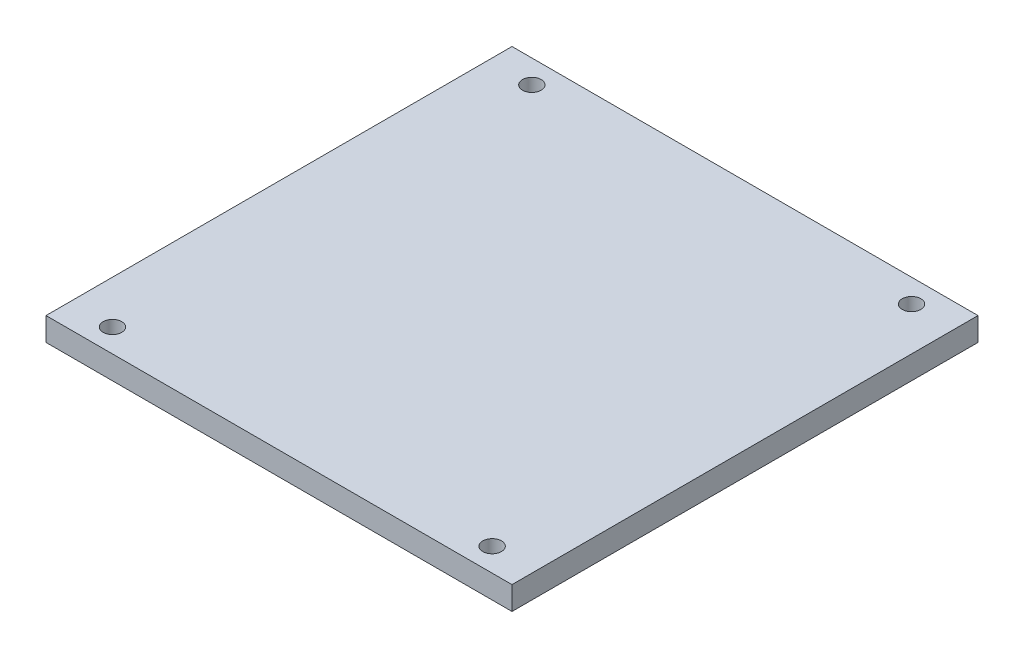
ISO-10303-21;
HEADER;
FILE_DESCRIPTION(('STEP AP214'),'2;1');
FILE_NAME('part.step','',(''),(''),'','','');
FILE_SCHEMA(('AUTOMOTIVE_DESIGN { 1 0 10303 214 1 1 1 1 }'));
ENDSEC;
DATA;
#1=APPLICATION_CONTEXT('core data for automotive mechanical design processes');
#2=APPLICATION_PROTOCOL_DEFINITION('international standard','automotive_design',2000,#1);
#3=PRODUCT_CONTEXT('',#1,'mechanical');
#4=PRODUCT('Part','Part','',(#3));
#5=PRODUCT_RELATED_PRODUCT_CATEGORY('part','',(#4));
#6=PRODUCT_DEFINITION_FORMATION('','',#4);
#7=PRODUCT_DEFINITION_CONTEXT('part definition',#1,'design');
#8=PRODUCT_DEFINITION('design','',#6,#7);
#9=PRODUCT_DEFINITION_SHAPE('','',#8);
#10=(LENGTH_UNIT() NAMED_UNIT(*) SI_UNIT(.MILLI.,.METRE.));
#11=(NAMED_UNIT(*) PLANE_ANGLE_UNIT() SI_UNIT($,.RADIAN.));
#12=(NAMED_UNIT(*) SI_UNIT($,.STERADIAN.) SOLID_ANGLE_UNIT());
#13=UNCERTAINTY_MEASURE_WITH_UNIT(LENGTH_MEASURE(1.E-05),#10,'distance_accuracy_value','');
#14=(GEOMETRIC_REPRESENTATION_CONTEXT(3) GLOBAL_UNCERTAINTY_ASSIGNED_CONTEXT((#13)) GLOBAL_UNIT_ASSIGNED_CONTEXT((#10,
#11,#12)) REPRESENTATION_CONTEXT('',''));
#15=CARTESIAN_POINT('',(0.,0.,0.));
#16=DIRECTION('',(0.,0.,1.));
#17=DIRECTION('',(1.,0.,0.));
#18=AXIS2_PLACEMENT_3D('',#15,#16,#17);
#19=CARTESIAN_POINT('',(63.5,6.35,63.5));
#20=DIRECTION('',(-1.,0.,0.));
#21=DIRECTION('',(0.,0.,1.));
#22=AXIS2_PLACEMENT_3D('',#19,#20,#21);
#23=PLANE('',#22);
#24=DIRECTION('',(0.,0.,-1.));
#25=VECTOR('',#24,1.);
#26=CARTESIAN_POINT('',(63.5,0.,63.5));
#27=LINE('',#26,#25);
#28=CARTESIAN_POINT('',(63.5,0.,63.5));
#29=VERTEX_POINT('',#28);
#30=CARTESIAN_POINT('',(63.5,0.,-63.5));
#31=VERTEX_POINT('',#30);
#32=EDGE_CURVE('E114',#29,#31,#27,.T.);
#33=ORIENTED_EDGE('',*,*,#32,.T.);
#34=DIRECTION('',(0.,-1.,0.));
#35=VECTOR('',#34,1.);
#36=CARTESIAN_POINT('',(63.5,6.35,-63.5));
#37=LINE('',#36,#35);
#38=CARTESIAN_POINT('',(63.5,6.35,-63.5));
#39=VERTEX_POINT('',#38);
#40=EDGE_CURVE('E11',#39,#31,#37,.T.);
#41=ORIENTED_EDGE('',*,*,#40,.F.);
#42=DIRECTION('',(0.,0.,-1.));
#43=VECTOR('',#42,1.);
#44=CARTESIAN_POINT('',(63.5,6.35,63.5));
#45=LINE('',#44,#43);
#46=CARTESIAN_POINT('',(63.5,6.35,63.5));
#47=VERTEX_POINT('',#46);
#48=EDGE_CURVE('E97',#47,#39,#45,.T.);
#49=ORIENTED_EDGE('',*,*,#48,.F.);
#50=DIRECTION('',(0.,-1.,0.));
#51=VECTOR('',#50,1.);
#52=CARTESIAN_POINT('',(63.5,6.35,63.5));
#53=LINE('',#52,#51);
#54=EDGE_CURVE('E110',#47,#29,#53,.T.);
#55=ORIENTED_EDGE('',*,*,#54,.T.);
#56=EDGE_LOOP('',(#33,#41,#49,#55));
#57=FACE_BOUND('',#56,.T.);
#58=ADVANCED_FACE('F43',(#57),#23,.F.);
#59=CARTESIAN_POINT('',(-63.5,6.35,-63.5));
#60=DIRECTION('',(0.,0.,1.));
#61=DIRECTION('',(1.,0.,0.));
#62=AXIS2_PLACEMENT_3D('',#59,#60,#61);
#63=PLANE('',#62);
#64=DIRECTION('',(-1.,0.,0.));
#65=VECTOR('',#64,1.);
#66=CARTESIAN_POINT('',(-63.5,0.,-63.5));
#67=LINE('',#66,#65);
#68=CARTESIAN_POINT('',(-63.5,0.,-63.5));
#69=VERTEX_POINT('',#68);
#70=EDGE_CURVE('E102',#31,#69,#67,.T.);
#71=ORIENTED_EDGE('',*,*,#70,.T.);
#72=DIRECTION('',(0.,-1.,0.));
#73=VECTOR('',#72,1.);
#74=CARTESIAN_POINT('',(-63.5,6.35,-63.5));
#75=LINE('',#74,#73);
#76=CARTESIAN_POINT('',(-63.5,6.35,-63.5));
#77=VERTEX_POINT('',#76);
#78=EDGE_CURVE('E53',#77,#69,#75,.T.);
#79=ORIENTED_EDGE('',*,*,#78,.F.);
#80=DIRECTION('',(-1.,0.,0.));
#81=VECTOR('',#80,1.);
#82=CARTESIAN_POINT('',(-63.5,6.35,-63.5));
#83=LINE('',#82,#81);
#84=EDGE_CURVE('E92',#39,#77,#83,.T.);
#85=ORIENTED_EDGE('',*,*,#84,.F.);
#86=ORIENTED_EDGE('',*,*,#40,.T.);
#87=EDGE_LOOP('',(#71,#79,#85,#86));
#88=FACE_BOUND('',#87,.T.);
#89=ADVANCED_FACE('F101',(#88),#63,.F.);
#90=CARTESIAN_POINT('',(-63.5,6.35,63.5));
#91=DIRECTION('',(1.,0.,0.));
#92=DIRECTION('',(0.,0.,-1.));
#93=AXIS2_PLACEMENT_3D('',#90,#91,#92);
#94=PLANE('',#93);
#95=DIRECTION('',(0.,0.,1.));
#96=VECTOR('',#95,1.);
#97=CARTESIAN_POINT('',(-63.5,0.,63.5));
#98=LINE('',#97,#96);
#99=CARTESIAN_POINT('',(-63.5,0.,63.5));
#100=VERTEX_POINT('',#99);
#101=EDGE_CURVE('E79',#69,#100,#98,.T.);
#102=ORIENTED_EDGE('',*,*,#101,.T.);
#103=DIRECTION('',(0.,-1.,0.));
#104=VECTOR('',#103,1.);
#105=CARTESIAN_POINT('',(-63.5,6.35,63.5));
#106=LINE('',#105,#104);
#107=CARTESIAN_POINT('',(-63.5,6.35,63.5));
#108=VERTEX_POINT('',#107);
#109=EDGE_CURVE('E104',#108,#100,#106,.T.);
#110=ORIENTED_EDGE('',*,*,#109,.F.);
#111=DIRECTION('',(0.,0.,1.));
#112=VECTOR('',#111,1.);
#113=CARTESIAN_POINT('',(-63.5,6.35,63.5));
#114=LINE('',#113,#112);
#115=EDGE_CURVE('E95',#77,#108,#114,.T.);
#116=ORIENTED_EDGE('',*,*,#115,.F.);
#117=ORIENTED_EDGE('',*,*,#78,.T.);
#118=EDGE_LOOP('',(#102,#110,#116,#117));
#119=FACE_BOUND('',#118,.T.);
#120=ADVANCED_FACE('F106',(#119),#94,.F.);
#121=CARTESIAN_POINT('',(-63.5,6.35,63.5));
#122=DIRECTION('',(0.,0.,-1.));
#123=DIRECTION('',(-1.,0.,0.));
#124=AXIS2_PLACEMENT_3D('',#121,#122,#123);
#125=PLANE('',#124);
#126=DIRECTION('',(1.,0.,0.));
#127=VECTOR('',#126,1.);
#128=CARTESIAN_POINT('',(-63.5,0.,63.5));
#129=LINE('',#128,#127);
#130=EDGE_CURVE('E85',#100,#29,#129,.T.);
#131=ORIENTED_EDGE('',*,*,#130,.T.);
#132=ORIENTED_EDGE('',*,*,#54,.F.);
#133=DIRECTION('',(1.,0.,0.));
#134=VECTOR('',#133,1.);
#135=CARTESIAN_POINT('',(-63.5,6.35,63.5));
#136=LINE('',#135,#134);
#137=EDGE_CURVE('E62',#108,#47,#136,.T.);
#138=ORIENTED_EDGE('',*,*,#137,.F.);
#139=ORIENTED_EDGE('',*,*,#109,.T.);
#140=EDGE_LOOP('',(#131,#132,#138,#139));
#141=FACE_BOUND('',#140,.T.);
#142=ADVANCED_FACE('F160',(#141),#125,.F.);
#143=CARTESIAN_POINT('',(0.,6.35,0.));
#144=DIRECTION('',(0.,-1.,0.));
#145=DIRECTION('',(0.,0.,-1.));
#146=AXIS2_PLACEMENT_3D('',#143,#144,#145);
#147=PLANE('',#146);
#148=CARTESIAN_POINT('',(51.7381484466503,6.35,-57.15));
#149=DIRECTION('',(0.,1.,0.));
#150=DIRECTION('',(0.,0.,1.));
#151=AXIS2_PLACEMENT_3D('',#148,#149,#150);
#152=CIRCLE('',#151,2.53999999999999);
#153=CARTESIAN_POINT('',(51.7381484466503,6.35,-54.61));
#154=VERTEX_POINT('',#153);
#155=EDGE_CURVE('E268',#154,#154,#152,.T.);
#156=ORIENTED_EDGE('',*,*,#155,.F.);
#157=EDGE_LOOP('',(#156));
#158=FACE_BOUND('',#157,.T.);
#159=CARTESIAN_POINT('',(-51.7381484466501,6.35,57.15));
#160=DIRECTION('',(0.,1.,0.));
#161=DIRECTION('',(0.,0.,1.));
#162=AXIS2_PLACEMENT_3D('',#159,#160,#161);
#163=CIRCLE('',#162,2.54000000000001);
#164=CARTESIAN_POINT('',(-51.7381484466501,6.35,59.69));
#165=VERTEX_POINT('',#164);
#166=EDGE_CURVE('E265',#165,#165,#163,.T.);
#167=ORIENTED_EDGE('',*,*,#166,.F.);
#168=EDGE_LOOP('',(#167));
#169=FACE_BOUND('',#168,.T.);
#170=CARTESIAN_POINT('',(51.7381484466503,6.35,57.15));
#171=DIRECTION('',(0.,1.,0.));
#172=DIRECTION('',(0.,0.,1.));
#173=AXIS2_PLACEMENT_3D('',#170,#171,#172);
#174=CIRCLE('',#173,2.54000000000001);
#175=CARTESIAN_POINT('',(51.7381484466503,6.35,59.69));
#176=VERTEX_POINT('',#175);
#177=EDGE_CURVE('E269',#176,#176,#174,.T.);
#178=ORIENTED_EDGE('',*,*,#177,.F.);
#179=EDGE_LOOP('',(#178));
#180=FACE_BOUND('',#179,.T.);
#181=CARTESIAN_POINT('',(-51.73814844665,6.35,-57.15));
#182=DIRECTION('',(0.,1.,0.));
#183=DIRECTION('',(0.,0.,1.));
#184=AXIS2_PLACEMENT_3D('',#181,#182,#183);
#185=CIRCLE('',#184,2.53999999999998);
#186=CARTESIAN_POINT('',(-51.73814844665,6.35,-54.61));
#187=VERTEX_POINT('',#186);
#188=EDGE_CURVE('E133',#187,#187,#185,.T.);
#189=ORIENTED_EDGE('',*,*,#188,.F.);
#190=EDGE_LOOP('',(#189));
#191=FACE_BOUND('',#190,.T.);
#192=ORIENTED_EDGE('',*,*,#48,.T.);
#193=ORIENTED_EDGE('',*,*,#84,.T.);
#194=ORIENTED_EDGE('',*,*,#115,.T.);
#195=ORIENTED_EDGE('',*,*,#137,.T.);
#196=EDGE_LOOP('',(#192,#193,#194,#195));
#197=FACE_BOUND('',#196,.T.);
#198=ADVANCED_FACE('F93',(#158,#169,#180,#191,#197),#147,.F.);
#199=CARTESIAN_POINT('',(0.,0.,0.));
#200=DIRECTION('',(0.,-1.,0.));
#201=DIRECTION('',(0.,0.,-1.));
#202=AXIS2_PLACEMENT_3D('',#199,#200,#201);
#203=PLANE('',#202);
#204=CARTESIAN_POINT('',(51.7381484466503,0.,-57.15));
#205=DIRECTION('',(0.,-1.,0.));
#206=DIRECTION('',(0.,0.,-1.));
#207=AXIS2_PLACEMENT_3D('',#204,#205,#206);
#208=CIRCLE('',#207,2.53999999999999);
#209=CARTESIAN_POINT('',(51.7381484466503,0.,-54.61));
#210=VERTEX_POINT('',#209);
#211=EDGE_CURVE('E46',#210,#210,#208,.T.);
#212=ORIENTED_EDGE('',*,*,#211,.F.);
#213=EDGE_LOOP('',(#212));
#214=FACE_BOUND('',#213,.T.);
#215=CARTESIAN_POINT('',(-51.7381484466501,0.,57.15));
#216=DIRECTION('',(0.,-1.,0.));
#217=DIRECTION('',(0.,0.,-1.));
#218=AXIS2_PLACEMENT_3D('',#215,#216,#217);
#219=CIRCLE('',#218,2.54000000000001);
#220=CARTESIAN_POINT('',(-51.7381484466501,0.,59.69));
#221=VERTEX_POINT('',#220);
#222=EDGE_CURVE('E136',#221,#221,#219,.T.);
#223=ORIENTED_EDGE('',*,*,#222,.F.);
#224=EDGE_LOOP('',(#223));
#225=FACE_BOUND('',#224,.T.);
#226=CARTESIAN_POINT('',(51.7381484466503,0.,57.15));
#227=DIRECTION('',(0.,-1.,0.));
#228=DIRECTION('',(0.,0.,-1.));
#229=AXIS2_PLACEMENT_3D('',#226,#227,#228);
#230=CIRCLE('',#229,2.54000000000001);
#231=CARTESIAN_POINT('',(51.7381484466503,0.,59.69));
#232=VERTEX_POINT('',#231);
#233=EDGE_CURVE('E132',#232,#232,#230,.T.);
#234=ORIENTED_EDGE('',*,*,#233,.F.);
#235=EDGE_LOOP('',(#234));
#236=FACE_BOUND('',#235,.T.);
#237=CARTESIAN_POINT('',(-51.73814844665,0.,-57.15));
#238=DIRECTION('',(0.,-1.,0.));
#239=DIRECTION('',(0.,0.,-1.));
#240=AXIS2_PLACEMENT_3D('',#237,#238,#239);
#241=CIRCLE('',#240,2.53999999999998);
#242=CARTESIAN_POINT('',(-51.73814844665,0.,-54.61));
#243=VERTEX_POINT('',#242);
#244=EDGE_CURVE('E128',#243,#243,#241,.T.);
#245=ORIENTED_EDGE('',*,*,#244,.F.);
#246=EDGE_LOOP('',(#245));
#247=FACE_BOUND('',#246,.T.);
#248=ORIENTED_EDGE('',*,*,#32,.F.);
#249=ORIENTED_EDGE('',*,*,#130,.F.);
#250=ORIENTED_EDGE('',*,*,#101,.F.);
#251=ORIENTED_EDGE('',*,*,#70,.F.);
#252=EDGE_LOOP('',(#248,#249,#250,#251));
#253=FACE_BOUND('',#252,.T.);
#254=ADVANCED_FACE('F148',(#214,#225,#236,#247,#253),#203,.T.);
#255=CARTESIAN_POINT('',(-51.73814844665,-3.175,-57.15));
#256=DIRECTION('',(0.,1.,0.));
#257=DIRECTION('',(0.,0.,1.));
#258=AXIS2_PLACEMENT_3D('',#255,#256,#257);
#259=CYLINDRICAL_SURFACE('',#258,2.53999999999998);
#260=CARTESIAN_POINT('',(-51.73814844665,0.,-54.61));
#261=CARTESIAN_POINT('',(-51.73814844665,0.0661458333333336,-54.61));
#262=CARTESIAN_POINT('',(-51.73814844665,0.132291666666667,-54.61));
#263=CARTESIAN_POINT('',(-51.73814844665,0.264583333333334,-54.61));
#264=CARTESIAN_POINT('',(-51.73814844665,0.330729166666667,-54.61));
#265=CARTESIAN_POINT('',(-51.73814844665,0.463020833333334,-54.61));
#266=CARTESIAN_POINT('',(-51.73814844665,0.529166666666667,-54.61));
#267=CARTESIAN_POINT('',(-51.73814844665,0.661458333333334,-54.61));
#268=CARTESIAN_POINT('',(-51.73814844665,0.727604166666667,-54.61));
#269=CARTESIAN_POINT('',(-51.73814844665,0.859895833333333,-54.61));
#270=CARTESIAN_POINT('',(-51.73814844665,0.926041666666667,-54.61));
#271=CARTESIAN_POINT('',(-51.73814844665,1.05833333333333,-54.61));
#272=CARTESIAN_POINT('',(-51.73814844665,1.12447916666667,-54.61));
#273=CARTESIAN_POINT('',(-51.73814844665,1.25677083333333,-54.61));
#274=CARTESIAN_POINT('',(-51.73814844665,1.32291666666667,-54.61));
#275=CARTESIAN_POINT('',(-51.73814844665,1.45520833333333,-54.61));
#276=CARTESIAN_POINT('',(-51.73814844665,1.52135416666667,-54.61));
#277=CARTESIAN_POINT('',(-51.73814844665,1.65364583333333,-54.61));
#278=CARTESIAN_POINT('',(-51.73814844665,1.71979166666667,-54.61));
#279=CARTESIAN_POINT('',(-51.73814844665,1.85208333333333,-54.61));
#280=CARTESIAN_POINT('',(-51.73814844665,1.91822916666667,-54.61));
#281=CARTESIAN_POINT('',(-51.73814844665,2.05052083333333,-54.61));
#282=CARTESIAN_POINT('',(-51.73814844665,2.11666666666667,-54.61));
#283=CARTESIAN_POINT('',(-51.73814844665,2.24895833333333,-54.61));
#284=CARTESIAN_POINT('',(-51.73814844665,2.31510416666667,-54.61));
#285=CARTESIAN_POINT('',(-51.73814844665,2.44739583333333,-54.61));
#286=CARTESIAN_POINT('',(-51.73814844665,2.51354166666667,-54.61));
#287=CARTESIAN_POINT('',(-51.73814844665,2.64583333333333,-54.61));
#288=CARTESIAN_POINT('',(-51.73814844665,2.71197916666667,-54.61));
#289=CARTESIAN_POINT('',(-51.73814844665,2.84427083333333,-54.61));
#290=CARTESIAN_POINT('',(-51.73814844665,2.91041666666667,-54.61));
#291=CARTESIAN_POINT('',(-51.73814844665,3.04270833333333,-54.61));
#292=CARTESIAN_POINT('',(-51.73814844665,3.10885416666667,-54.61));
#293=CARTESIAN_POINT('',(-51.73814844665,3.24114583333333,-54.61));
#294=CARTESIAN_POINT('',(-51.73814844665,3.30729166666667,-54.61));
#295=CARTESIAN_POINT('',(-51.73814844665,3.43958333333333,-54.61));
#296=CARTESIAN_POINT('',(-51.73814844665,3.50572916666667,-54.61));
#297=CARTESIAN_POINT('',(-51.73814844665,3.63802083333333,-54.61));
#298=CARTESIAN_POINT('',(-51.73814844665,3.70416666666667,-54.61));
#299=CARTESIAN_POINT('',(-51.73814844665,3.83645833333333,-54.61));
#300=CARTESIAN_POINT('',(-51.73814844665,3.90260416666667,-54.61));
#301=CARTESIAN_POINT('',(-51.73814844665,4.03489583333333,-54.61));
#302=CARTESIAN_POINT('',(-51.73814844665,4.10104166666667,-54.61));
#303=CARTESIAN_POINT('',(-51.73814844665,4.23333333333333,-54.61));
#304=CARTESIAN_POINT('',(-51.73814844665,4.29947916666667,-54.61));
#305=CARTESIAN_POINT('',(-51.73814844665,4.43177083333333,-54.61));
#306=CARTESIAN_POINT('',(-51.73814844665,4.49791666666667,-54.61));
#307=CARTESIAN_POINT('',(-51.73814844665,4.63020833333333,-54.61));
#308=CARTESIAN_POINT('',(-51.73814844665,4.69635416666667,-54.61));
#309=CARTESIAN_POINT('',(-51.73814844665,4.82864583333333,-54.61));
#310=CARTESIAN_POINT('',(-51.73814844665,4.89479166666667,-54.61));
#311=CARTESIAN_POINT('',(-51.73814844665,5.02708333333333,-54.61));
#312=CARTESIAN_POINT('',(-51.73814844665,5.09322916666667,-54.61));
#313=CARTESIAN_POINT('',(-51.73814844665,5.22552083333333,-54.61));
#314=CARTESIAN_POINT('',(-51.73814844665,5.29166666666667,-54.61));
#315=CARTESIAN_POINT('',(-51.73814844665,5.42395833333333,-54.61));
#316=CARTESIAN_POINT('',(-51.73814844665,5.49010416666667,-54.61));
#317=CARTESIAN_POINT('',(-51.73814844665,5.62239583333333,-54.61));
#318=CARTESIAN_POINT('',(-51.73814844665,5.68854166666667,-54.61));
#319=CARTESIAN_POINT('',(-51.73814844665,5.82083333333333,-54.61));
#320=CARTESIAN_POINT('',(-51.73814844665,5.88697916666667,-54.61));
#321=CARTESIAN_POINT('',(-51.73814844665,6.01927083333333,-54.61));
#322=CARTESIAN_POINT('',(-51.73814844665,6.08541666666667,-54.61));
#323=CARTESIAN_POINT('',(-51.73814844665,6.21770833333333,-54.61));
#324=CARTESIAN_POINT('',(-51.73814844665,6.28385416666667,-54.61));
#325=CARTESIAN_POINT('',(-51.73814844665,6.35,-54.61));
#326=B_SPLINE_CURVE_WITH_KNOTS('',3,(#260,#261,#262,#263,#264,#265,#266,#267,#268,#269,#270,
#271,#272,#273,#274,#275,#276,#277,#278,#279,#280,#281,#282,#283,#284,#285,#286,#287,#288,#289,
#290,#291,#292,#293,#294,#295,#296,#297,#298,#299,#300,#301,#302,#303,#304,#305,#306,#307,#308,
#309,#310,#311,#312,#313,#314,#315,#316,#317,#318,#319,#320,#321,#322,#323,#324,#325),
.UNSPECIFIED.,.F.,.F.,(4,2,2,2,2,2,2,2,2,2,2,2,2,2,2,2,2,2,2,2,2,2,2,2,2,2,2,2,2,2,2,2,4),(0.,
0.1984375,0.396875,0.5953125,0.79375,0.9921875,1.190625,1.3890625,1.5875,1.7859375,1.984375,
2.1828125,2.38125,2.5796875,2.778125,2.9765625,3.175,3.3734375,3.571875,3.7703125,3.96875,
4.1671875,4.365625,4.5640625,4.7625,4.9609375,5.159375,5.3578125,5.55625,5.7546875,5.953125,
6.1515625,6.35),.UNSPECIFIED.);
#327=EDGE_CURVE('BSEAM151',#243,#187,#326,.T.);
#328=ORIENTED_EDGE('',*,*,#244,.T.);
#329=ORIENTED_EDGE('',*,*,#188,.T.);
#330=ORIENTED_EDGE('',*,*,#327,.T.);
#331=ORIENTED_EDGE('',*,*,#327,.F.);
#332=EDGE_LOOP('',(#328,#330,#329,#331));
#333=FACE_BOUND('',#332,.T.);
#334=ADVANCED_FACE('F151',(#333),#259,.F.);
#335=CARTESIAN_POINT('',(51.7381484466503,-3.175,57.15));
#336=DIRECTION('',(0.,1.,0.));
#337=DIRECTION('',(0.,0.,1.));
#338=AXIS2_PLACEMENT_3D('',#335,#336,#337);
#339=CYLINDRICAL_SURFACE('',#338,2.54000000000001);
#340=CARTESIAN_POINT('',(51.7381484466503,0.,59.69));
#341=CARTESIAN_POINT('',(51.7381484466503,0.0661458333333336,59.69));
#342=CARTESIAN_POINT('',(51.7381484466503,0.132291666666667,59.69));
#343=CARTESIAN_POINT('',(51.7381484466503,0.264583333333334,59.69));
#344=CARTESIAN_POINT('',(51.7381484466503,0.330729166666667,59.69));
#345=CARTESIAN_POINT('',(51.7381484466503,0.463020833333334,59.69));
#346=CARTESIAN_POINT('',(51.7381484466503,0.529166666666667,59.69));
#347=CARTESIAN_POINT('',(51.7381484466503,0.661458333333334,59.69));
#348=CARTESIAN_POINT('',(51.7381484466503,0.727604166666667,59.69));
#349=CARTESIAN_POINT('',(51.7381484466503,0.859895833333333,59.69));
#350=CARTESIAN_POINT('',(51.7381484466503,0.926041666666667,59.69));
#351=CARTESIAN_POINT('',(51.7381484466503,1.05833333333333,59.69));
#352=CARTESIAN_POINT('',(51.7381484466503,1.12447916666667,59.69));
#353=CARTESIAN_POINT('',(51.7381484466503,1.25677083333333,59.69));
#354=CARTESIAN_POINT('',(51.7381484466503,1.32291666666667,59.69));
#355=CARTESIAN_POINT('',(51.7381484466503,1.45520833333333,59.69));
#356=CARTESIAN_POINT('',(51.7381484466503,1.52135416666667,59.69));
#357=CARTESIAN_POINT('',(51.7381484466503,1.65364583333333,59.69));
#358=CARTESIAN_POINT('',(51.7381484466503,1.71979166666667,59.69));
#359=CARTESIAN_POINT('',(51.7381484466503,1.85208333333333,59.69));
#360=CARTESIAN_POINT('',(51.7381484466503,1.91822916666667,59.69));
#361=CARTESIAN_POINT('',(51.7381484466503,2.05052083333333,59.69));
#362=CARTESIAN_POINT('',(51.7381484466503,2.11666666666667,59.69));
#363=CARTESIAN_POINT('',(51.7381484466503,2.24895833333333,59.69));
#364=CARTESIAN_POINT('',(51.7381484466503,2.31510416666667,59.69));
#365=CARTESIAN_POINT('',(51.7381484466503,2.44739583333333,59.69));
#366=CARTESIAN_POINT('',(51.7381484466503,2.51354166666667,59.69));
#367=CARTESIAN_POINT('',(51.7381484466503,2.64583333333333,59.69));
#368=CARTESIAN_POINT('',(51.7381484466503,2.71197916666667,59.69));
#369=CARTESIAN_POINT('',(51.7381484466503,2.84427083333333,59.69));
#370=CARTESIAN_POINT('',(51.7381484466503,2.91041666666667,59.69));
#371=CARTESIAN_POINT('',(51.7381484466503,3.04270833333333,59.69));
#372=CARTESIAN_POINT('',(51.7381484466503,3.10885416666667,59.69));
#373=CARTESIAN_POINT('',(51.7381484466503,3.24114583333333,59.69));
#374=CARTESIAN_POINT('',(51.7381484466503,3.30729166666667,59.69));
#375=CARTESIAN_POINT('',(51.7381484466503,3.43958333333333,59.69));
#376=CARTESIAN_POINT('',(51.7381484466503,3.50572916666667,59.69));
#377=CARTESIAN_POINT('',(51.7381484466503,3.63802083333333,59.69));
#378=CARTESIAN_POINT('',(51.7381484466503,3.70416666666667,59.69));
#379=CARTESIAN_POINT('',(51.7381484466503,3.83645833333333,59.69));
#380=CARTESIAN_POINT('',(51.7381484466503,3.90260416666667,59.69));
#381=CARTESIAN_POINT('',(51.7381484466503,4.03489583333333,59.69));
#382=CARTESIAN_POINT('',(51.7381484466503,4.10104166666667,59.69));
#383=CARTESIAN_POINT('',(51.7381484466503,4.23333333333333,59.69));
#384=CARTESIAN_POINT('',(51.7381484466503,4.29947916666667,59.69));
#385=CARTESIAN_POINT('',(51.7381484466503,4.43177083333333,59.69));
#386=CARTESIAN_POINT('',(51.7381484466503,4.49791666666667,59.69));
#387=CARTESIAN_POINT('',(51.7381484466503,4.63020833333333,59.69));
#388=CARTESIAN_POINT('',(51.7381484466503,4.69635416666667,59.69));
#389=CARTESIAN_POINT('',(51.7381484466503,4.82864583333333,59.69));
#390=CARTESIAN_POINT('',(51.7381484466503,4.89479166666667,59.69));
#391=CARTESIAN_POINT('',(51.7381484466503,5.02708333333333,59.69));
#392=CARTESIAN_POINT('',(51.7381484466503,5.09322916666667,59.69));
#393=CARTESIAN_POINT('',(51.7381484466503,5.22552083333333,59.69));
#394=CARTESIAN_POINT('',(51.7381484466503,5.29166666666667,59.69));
#395=CARTESIAN_POINT('',(51.7381484466503,5.42395833333333,59.69));
#396=CARTESIAN_POINT('',(51.7381484466503,5.49010416666667,59.69));
#397=CARTESIAN_POINT('',(51.7381484466503,5.62239583333333,59.69));
#398=CARTESIAN_POINT('',(51.7381484466503,5.68854166666667,59.69));
#399=CARTESIAN_POINT('',(51.7381484466503,5.82083333333333,59.69));
#400=CARTESIAN_POINT('',(51.7381484466503,5.88697916666667,59.69));
#401=CARTESIAN_POINT('',(51.7381484466503,6.01927083333333,59.69));
#402=CARTESIAN_POINT('',(51.7381484466503,6.08541666666667,59.69));
#403=CARTESIAN_POINT('',(51.7381484466503,6.21770833333333,59.69));
#404=CARTESIAN_POINT('',(51.7381484466503,6.28385416666667,59.69));
#405=CARTESIAN_POINT('',(51.7381484466503,6.35,59.69));
#406=B_SPLINE_CURVE_WITH_KNOTS('',3,(#340,#341,#342,#343,#344,#345,#346,#347,#348,#349,#350,
#351,#352,#353,#354,#355,#356,#357,#358,#359,#360,#361,#362,#363,#364,#365,#366,#367,#368,#369,
#370,#371,#372,#373,#374,#375,#376,#377,#378,#379,#380,#381,#382,#383,#384,#385,#386,#387,#388,
#389,#390,#391,#392,#393,#394,#395,#396,#397,#398,#399,#400,#401,#402,#403,#404,#405),
.UNSPECIFIED.,.F.,.F.,(4,2,2,2,2,2,2,2,2,2,2,2,2,2,2,2,2,2,2,2,2,2,2,2,2,2,2,2,2,2,2,2,4),(0.,
0.1984375,0.396875,0.5953125,0.79375,0.9921875,1.190625,1.3890625,1.5875,1.7859375,1.984375,
2.1828125,2.38125,2.5796875,2.778125,2.9765625,3.175,3.3734375,3.571875,3.7703125,3.96875,
4.1671875,4.365625,4.5640625,4.7625,4.9609375,5.159375,5.3578125,5.55625,5.7546875,5.953125,
6.1515625,6.35),.UNSPECIFIED.);
#407=EDGE_CURVE('BSEAM209',#232,#176,#406,.T.);
#408=ORIENTED_EDGE('',*,*,#233,.T.);
#409=ORIENTED_EDGE('',*,*,#177,.T.);
#410=ORIENTED_EDGE('',*,*,#407,.T.);
#411=ORIENTED_EDGE('',*,*,#407,.F.);
#412=EDGE_LOOP('',(#408,#410,#409,#411));
#413=FACE_BOUND('',#412,.T.);
#414=ADVANCED_FACE('F209',(#413),#339,.F.);
#415=CARTESIAN_POINT('',(-51.7381484466501,-3.175,57.15));
#416=DIRECTION('',(0.,1.,0.));
#417=DIRECTION('',(0.,0.,1.));
#418=AXIS2_PLACEMENT_3D('',#415,#416,#417);
#419=CYLINDRICAL_SURFACE('',#418,2.54000000000001);
#420=CARTESIAN_POINT('',(-51.7381484466501,0.,59.69));
#421=CARTESIAN_POINT('',(-51.7381484466501,0.0661458333333336,59.69));
#422=CARTESIAN_POINT('',(-51.7381484466501,0.132291666666667,59.69));
#423=CARTESIAN_POINT('',(-51.7381484466501,0.264583333333334,59.69));
#424=CARTESIAN_POINT('',(-51.7381484466501,0.330729166666667,59.69));
#425=CARTESIAN_POINT('',(-51.7381484466501,0.463020833333334,59.69));
#426=CARTESIAN_POINT('',(-51.7381484466501,0.529166666666667,59.69));
#427=CARTESIAN_POINT('',(-51.7381484466501,0.661458333333334,59.69));
#428=CARTESIAN_POINT('',(-51.7381484466501,0.727604166666667,59.69));
#429=CARTESIAN_POINT('',(-51.7381484466501,0.859895833333333,59.69));
#430=CARTESIAN_POINT('',(-51.7381484466501,0.926041666666667,59.69));
#431=CARTESIAN_POINT('',(-51.7381484466501,1.05833333333333,59.69));
#432=CARTESIAN_POINT('',(-51.7381484466501,1.12447916666667,59.69));
#433=CARTESIAN_POINT('',(-51.7381484466501,1.25677083333333,59.69));
#434=CARTESIAN_POINT('',(-51.7381484466501,1.32291666666667,59.69));
#435=CARTESIAN_POINT('',(-51.7381484466501,1.45520833333333,59.69));
#436=CARTESIAN_POINT('',(-51.7381484466501,1.52135416666667,59.69));
#437=CARTESIAN_POINT('',(-51.7381484466501,1.65364583333333,59.69));
#438=CARTESIAN_POINT('',(-51.7381484466501,1.71979166666667,59.69));
#439=CARTESIAN_POINT('',(-51.7381484466501,1.85208333333333,59.69));
#440=CARTESIAN_POINT('',(-51.7381484466501,1.91822916666667,59.69));
#441=CARTESIAN_POINT('',(-51.7381484466501,2.05052083333333,59.69));
#442=CARTESIAN_POINT('',(-51.7381484466501,2.11666666666667,59.69));
#443=CARTESIAN_POINT('',(-51.7381484466501,2.24895833333333,59.69));
#444=CARTESIAN_POINT('',(-51.7381484466501,2.31510416666667,59.69));
#445=CARTESIAN_POINT('',(-51.7381484466501,2.44739583333333,59.69));
#446=CARTESIAN_POINT('',(-51.7381484466501,2.51354166666667,59.69));
#447=CARTESIAN_POINT('',(-51.7381484466501,2.64583333333333,59.69));
#448=CARTESIAN_POINT('',(-51.7381484466501,2.71197916666667,59.69));
#449=CARTESIAN_POINT('',(-51.7381484466501,2.84427083333333,59.69));
#450=CARTESIAN_POINT('',(-51.7381484466501,2.91041666666667,59.69));
#451=CARTESIAN_POINT('',(-51.7381484466501,3.04270833333333,59.69));
#452=CARTESIAN_POINT('',(-51.7381484466501,3.10885416666667,59.69));
#453=CARTESIAN_POINT('',(-51.7381484466501,3.24114583333333,59.69));
#454=CARTESIAN_POINT('',(-51.7381484466501,3.30729166666667,59.69));
#455=CARTESIAN_POINT('',(-51.7381484466501,3.43958333333333,59.69));
#456=CARTESIAN_POINT('',(-51.7381484466501,3.50572916666667,59.69));
#457=CARTESIAN_POINT('',(-51.7381484466501,3.63802083333333,59.69));
#458=CARTESIAN_POINT('',(-51.7381484466501,3.70416666666667,59.69));
#459=CARTESIAN_POINT('',(-51.7381484466501,3.83645833333333,59.69));
#460=CARTESIAN_POINT('',(-51.7381484466501,3.90260416666667,59.69));
#461=CARTESIAN_POINT('',(-51.7381484466501,4.03489583333333,59.69));
#462=CARTESIAN_POINT('',(-51.7381484466501,4.10104166666667,59.69));
#463=CARTESIAN_POINT('',(-51.7381484466501,4.23333333333333,59.69));
#464=CARTESIAN_POINT('',(-51.7381484466501,4.29947916666667,59.69));
#465=CARTESIAN_POINT('',(-51.7381484466501,4.43177083333333,59.69));
#466=CARTESIAN_POINT('',(-51.7381484466501,4.49791666666667,59.69));
#467=CARTESIAN_POINT('',(-51.7381484466501,4.63020833333333,59.69));
#468=CARTESIAN_POINT('',(-51.7381484466501,4.69635416666667,59.69));
#469=CARTESIAN_POINT('',(-51.7381484466501,4.82864583333333,59.69));
#470=CARTESIAN_POINT('',(-51.7381484466501,4.89479166666667,59.69));
#471=CARTESIAN_POINT('',(-51.7381484466501,5.02708333333333,59.69));
#472=CARTESIAN_POINT('',(-51.7381484466501,5.09322916666667,59.69));
#473=CARTESIAN_POINT('',(-51.7381484466501,5.22552083333333,59.69));
#474=CARTESIAN_POINT('',(-51.7381484466501,5.29166666666667,59.69));
#475=CARTESIAN_POINT('',(-51.7381484466501,5.42395833333333,59.69));
#476=CARTESIAN_POINT('',(-51.7381484466501,5.49010416666667,59.69));
#477=CARTESIAN_POINT('',(-51.7381484466501,5.62239583333333,59.69));
#478=CARTESIAN_POINT('',(-51.7381484466501,5.68854166666667,59.69));
#479=CARTESIAN_POINT('',(-51.7381484466501,5.82083333333333,59.69));
#480=CARTESIAN_POINT('',(-51.7381484466501,5.88697916666667,59.69));
#481=CARTESIAN_POINT('',(-51.7381484466501,6.01927083333333,59.69));
#482=CARTESIAN_POINT('',(-51.7381484466501,6.08541666666667,59.69));
#483=CARTESIAN_POINT('',(-51.7381484466501,6.21770833333333,59.69));
#484=CARTESIAN_POINT('',(-51.7381484466501,6.28385416666667,59.69));
#485=CARTESIAN_POINT('',(-51.7381484466501,6.35,59.69));
#486=B_SPLINE_CURVE_WITH_KNOTS('',3,(#420,#421,#422,#423,#424,#425,#426,#427,#428,#429,#430,
#431,#432,#433,#434,#435,#436,#437,#438,#439,#440,#441,#442,#443,#444,#445,#446,#447,#448,#449,
#450,#451,#452,#453,#454,#455,#456,#457,#458,#459,#460,#461,#462,#463,#464,#465,#466,#467,#468,
#469,#470,#471,#472,#473,#474,#475,#476,#477,#478,#479,#480,#481,#482,#483,#484,#485),
.UNSPECIFIED.,.F.,.F.,(4,2,2,2,2,2,2,2,2,2,2,2,2,2,2,2,2,2,2,2,2,2,2,2,2,2,2,2,2,2,2,2,4),(0.,
0.1984375,0.396875,0.5953125,0.79375,0.9921875,1.190625,1.3890625,1.5875,1.7859375,1.984375,
2.1828125,2.38125,2.5796875,2.778125,2.9765625,3.175,3.3734375,3.571875,3.7703125,3.96875,
4.1671875,4.365625,4.5640625,4.7625,4.9609375,5.159375,5.3578125,5.55625,5.7546875,5.953125,
6.1515625,6.35),.UNSPECIFIED.);
#487=EDGE_CURVE('BSEAM220',#221,#165,#486,.T.);
#488=ORIENTED_EDGE('',*,*,#222,.T.);
#489=ORIENTED_EDGE('',*,*,#166,.T.);
#490=ORIENTED_EDGE('',*,*,#487,.T.);
#491=ORIENTED_EDGE('',*,*,#487,.F.);
#492=EDGE_LOOP('',(#488,#490,#489,#491));
#493=FACE_BOUND('',#492,.T.);
#494=ADVANCED_FACE('F220',(#493),#419,.F.);
#495=CARTESIAN_POINT('',(51.7381484466503,-3.175,-57.15));
#496=DIRECTION('',(0.,1.,0.));
#497=DIRECTION('',(0.,0.,1.));
#498=AXIS2_PLACEMENT_3D('',#495,#496,#497);
#499=CYLINDRICAL_SURFACE('',#498,2.53999999999999);
#500=CARTESIAN_POINT('',(51.7381484466503,0.,-54.61));
#501=CARTESIAN_POINT('',(51.7381484466503,0.0661458333333336,-54.61));
#502=CARTESIAN_POINT('',(51.7381484466503,0.132291666666667,-54.61));
#503=CARTESIAN_POINT('',(51.7381484466503,0.264583333333334,-54.61));
#504=CARTESIAN_POINT('',(51.7381484466503,0.330729166666667,-54.61));
#505=CARTESIAN_POINT('',(51.7381484466503,0.463020833333334,-54.61));
#506=CARTESIAN_POINT('',(51.7381484466503,0.529166666666667,-54.61));
#507=CARTESIAN_POINT('',(51.7381484466503,0.661458333333334,-54.61));
#508=CARTESIAN_POINT('',(51.7381484466503,0.727604166666667,-54.61));
#509=CARTESIAN_POINT('',(51.7381484466503,0.859895833333333,-54.61));
#510=CARTESIAN_POINT('',(51.7381484466503,0.926041666666667,-54.61));
#511=CARTESIAN_POINT('',(51.7381484466503,1.05833333333333,-54.61));
#512=CARTESIAN_POINT('',(51.7381484466503,1.12447916666667,-54.61));
#513=CARTESIAN_POINT('',(51.7381484466503,1.25677083333333,-54.61));
#514=CARTESIAN_POINT('',(51.7381484466503,1.32291666666667,-54.61));
#515=CARTESIAN_POINT('',(51.7381484466503,1.45520833333333,-54.61));
#516=CARTESIAN_POINT('',(51.7381484466503,1.52135416666667,-54.61));
#517=CARTESIAN_POINT('',(51.7381484466503,1.65364583333333,-54.61));
#518=CARTESIAN_POINT('',(51.7381484466503,1.71979166666667,-54.61));
#519=CARTESIAN_POINT('',(51.7381484466503,1.85208333333333,-54.61));
#520=CARTESIAN_POINT('',(51.7381484466503,1.91822916666667,-54.61));
#521=CARTESIAN_POINT('',(51.7381484466503,2.05052083333333,-54.61));
#522=CARTESIAN_POINT('',(51.7381484466503,2.11666666666667,-54.61));
#523=CARTESIAN_POINT('',(51.7381484466503,2.24895833333333,-54.61));
#524=CARTESIAN_POINT('',(51.7381484466503,2.31510416666667,-54.61));
#525=CARTESIAN_POINT('',(51.7381484466503,2.44739583333333,-54.61));
#526=CARTESIAN_POINT('',(51.7381484466503,2.51354166666667,-54.61));
#527=CARTESIAN_POINT('',(51.7381484466503,2.64583333333333,-54.61));
#528=CARTESIAN_POINT('',(51.7381484466503,2.71197916666667,-54.61));
#529=CARTESIAN_POINT('',(51.7381484466503,2.84427083333333,-54.61));
#530=CARTESIAN_POINT('',(51.7381484466503,2.91041666666667,-54.61));
#531=CARTESIAN_POINT('',(51.7381484466503,3.04270833333333,-54.61));
#532=CARTESIAN_POINT('',(51.7381484466503,3.10885416666667,-54.61));
#533=CARTESIAN_POINT('',(51.7381484466503,3.24114583333333,-54.61));
#534=CARTESIAN_POINT('',(51.7381484466503,3.30729166666667,-54.61));
#535=CARTESIAN_POINT('',(51.7381484466503,3.43958333333333,-54.61));
#536=CARTESIAN_POINT('',(51.7381484466503,3.50572916666667,-54.61));
#537=CARTESIAN_POINT('',(51.7381484466503,3.63802083333333,-54.61));
#538=CARTESIAN_POINT('',(51.7381484466503,3.70416666666667,-54.61));
#539=CARTESIAN_POINT('',(51.7381484466503,3.83645833333333,-54.61));
#540=CARTESIAN_POINT('',(51.7381484466503,3.90260416666667,-54.61));
#541=CARTESIAN_POINT('',(51.7381484466503,4.03489583333333,-54.61));
#542=CARTESIAN_POINT('',(51.7381484466503,4.10104166666667,-54.61));
#543=CARTESIAN_POINT('',(51.7381484466503,4.23333333333333,-54.61));
#544=CARTESIAN_POINT('',(51.7381484466503,4.29947916666667,-54.61));
#545=CARTESIAN_POINT('',(51.7381484466503,4.43177083333333,-54.61));
#546=CARTESIAN_POINT('',(51.7381484466503,4.49791666666667,-54.61));
#547=CARTESIAN_POINT('',(51.7381484466503,4.63020833333333,-54.61));
#548=CARTESIAN_POINT('',(51.7381484466503,4.69635416666667,-54.61));
#549=CARTESIAN_POINT('',(51.7381484466503,4.82864583333333,-54.61));
#550=CARTESIAN_POINT('',(51.7381484466503,4.89479166666667,-54.61));
#551=CARTESIAN_POINT('',(51.7381484466503,5.02708333333333,-54.61));
#552=CARTESIAN_POINT('',(51.7381484466503,5.09322916666667,-54.61));
#553=CARTESIAN_POINT('',(51.7381484466503,5.22552083333333,-54.61));
#554=CARTESIAN_POINT('',(51.7381484466503,5.29166666666667,-54.61));
#555=CARTESIAN_POINT('',(51.7381484466503,5.42395833333333,-54.61));
#556=CARTESIAN_POINT('',(51.7381484466503,5.49010416666667,-54.61));
#557=CARTESIAN_POINT('',(51.7381484466503,5.62239583333333,-54.61));
#558=CARTESIAN_POINT('',(51.7381484466503,5.68854166666667,-54.61));
#559=CARTESIAN_POINT('',(51.7381484466503,5.82083333333333,-54.61));
#560=CARTESIAN_POINT('',(51.7381484466503,5.88697916666667,-54.61));
#561=CARTESIAN_POINT('',(51.7381484466503,6.01927083333333,-54.61));
#562=CARTESIAN_POINT('',(51.7381484466503,6.08541666666667,-54.61));
#563=CARTESIAN_POINT('',(51.7381484466503,6.21770833333333,-54.61));
#564=CARTESIAN_POINT('',(51.7381484466503,6.28385416666667,-54.61));
#565=CARTESIAN_POINT('',(51.7381484466503,6.35,-54.61));
#566=B_SPLINE_CURVE_WITH_KNOTS('',3,(#500,#501,#502,#503,#504,#505,#506,#507,#508,#509,#510,
#511,#512,#513,#514,#515,#516,#517,#518,#519,#520,#521,#522,#523,#524,#525,#526,#527,#528,#529,
#530,#531,#532,#533,#534,#535,#536,#537,#538,#539,#540,#541,#542,#543,#544,#545,#546,#547,#548,
#549,#550,#551,#552,#553,#554,#555,#556,#557,#558,#559,#560,#561,#562,#563,#564,#565),
.UNSPECIFIED.,.F.,.F.,(4,2,2,2,2,2,2,2,2,2,2,2,2,2,2,2,2,2,2,2,2,2,2,2,2,2,2,2,2,2,2,2,4),(0.,
0.1984375,0.396875,0.5953125,0.79375,0.9921875,1.190625,1.3890625,1.5875,1.7859375,1.984375,
2.1828125,2.38125,2.5796875,2.778125,2.9765625,3.175,3.3734375,3.571875,3.7703125,3.96875,
4.1671875,4.365625,4.5640625,4.7625,4.9609375,5.159375,5.3578125,5.55625,5.7546875,5.953125,
6.1515625,6.35),.UNSPECIFIED.);
#567=EDGE_CURVE('BSEAM145',#210,#154,#566,.T.);
#568=ORIENTED_EDGE('',*,*,#211,.T.);
#569=ORIENTED_EDGE('',*,*,#155,.T.);
#570=ORIENTED_EDGE('',*,*,#567,.T.);
#571=ORIENTED_EDGE('',*,*,#567,.F.);
#572=EDGE_LOOP('',(#568,#570,#569,#571));
#573=FACE_BOUND('',#572,.T.);
#574=ADVANCED_FACE('F145',(#573),#499,.F.);
#575=CLOSED_SHELL('',(#58,#89,#120,#142,#198,#254,#334,#414,#494,#574));
#576=MANIFOLD_SOLID_BREP('B2',#575);
#577=ADVANCED_BREP_SHAPE_REPRESENTATION('',(#18,#576),#14);
#578=SHAPE_DEFINITION_REPRESENTATION(#9,#577);
ENDSEC;
END-ISO-10303-21;
